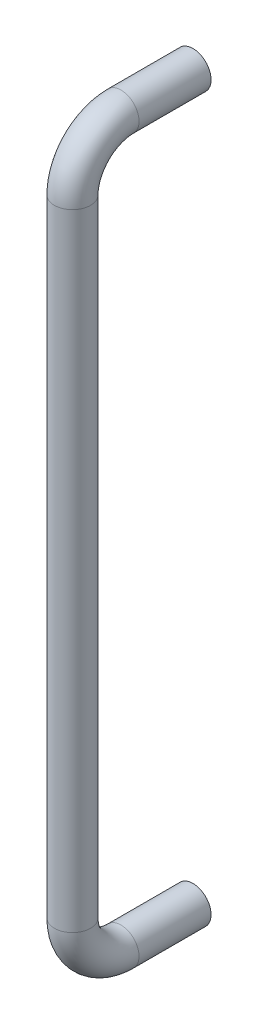
ISO-10303-21;
HEADER;
FILE_DESCRIPTION(('STEP AP214'),'2;1');
FILE_NAME('part.step','',(''),(''),'','','');
FILE_SCHEMA(('AUTOMOTIVE_DESIGN { 1 0 10303 214 1 1 1 1 }'));
ENDSEC;
DATA;
#1=APPLICATION_CONTEXT('core data for automotive mechanical design processes');
#2=APPLICATION_PROTOCOL_DEFINITION('international standard','automotive_design',2000,#1);
#3=PRODUCT_CONTEXT('',#1,'mechanical');
#4=PRODUCT('Part','Part','',(#3));
#5=PRODUCT_RELATED_PRODUCT_CATEGORY('part','',(#4));
#6=PRODUCT_DEFINITION_FORMATION('','',#4);
#7=PRODUCT_DEFINITION_CONTEXT('part definition',#1,'design');
#8=PRODUCT_DEFINITION('design','',#6,#7);
#9=PRODUCT_DEFINITION_SHAPE('','',#8);
#10=(LENGTH_UNIT() NAMED_UNIT(*) SI_UNIT(.MILLI.,.METRE.));
#11=(NAMED_UNIT(*) PLANE_ANGLE_UNIT() SI_UNIT($,.RADIAN.));
#12=(NAMED_UNIT(*) SI_UNIT($,.STERADIAN.) SOLID_ANGLE_UNIT());
#13=UNCERTAINTY_MEASURE_WITH_UNIT(LENGTH_MEASURE(1.E-05),#10,'distance_accuracy_value','');
#14=(GEOMETRIC_REPRESENTATION_CONTEXT(3) GLOBAL_UNCERTAINTY_ASSIGNED_CONTEXT((#13)) GLOBAL_UNIT_ASSIGNED_CONTEXT((#10,
#11,#12)) REPRESENTATION_CONTEXT('',''));
#15=CARTESIAN_POINT('',(0.,0.,0.));
#16=DIRECTION('',(0.,0.,1.));
#17=DIRECTION('',(1.,0.,0.));
#18=AXIS2_PLACEMENT_3D('',#15,#16,#17);
#19=CARTESIAN_POINT('',(0.,0.,0.));
#20=DIRECTION('',(0.,0.,1.));
#21=DIRECTION('',(1.,0.,0.));
#22=AXIS2_PLACEMENT_3D('',#19,#20,#21);
#23=PLANE('',#22);
#24=CARTESIAN_POINT('',(0.,0.,0.));
#25=DIRECTION('',(0.,0.,1.));
#26=DIRECTION('',(1.,0.,0.));
#27=AXIS2_PLACEMENT_3D('',#24,#25,#26);
#28=CIRCLE('',#27,0.15);
#29=CARTESIAN_POINT('',(0.15,0.,0.));
#30=VERTEX_POINT('',#29);
#31=EDGE_CURVE('E18',#30,#30,#28,.T.);
#32=ORIENTED_EDGE('',*,*,#31,.F.);
#33=EDGE_LOOP('',(#32));
#34=FACE_BOUND('',#33,.T.);
#35=ADVANCED_FACE('F15',(#34),#23,.F.);
#36=CARTESIAN_POINT('',(0.,6.,0.));
#37=DIRECTION('',(0.,0.,-1.));
#38=DIRECTION('',(0.,1.,0.));
#39=AXIS2_PLACEMENT_3D('',#36,#37,#38);
#40=PLANE('',#39);
#41=CARTESIAN_POINT('',(0.,6.,0.));
#42=DIRECTION('',(0.,0.,-1.));
#43=DIRECTION('',(0.,1.,0.));
#44=AXIS2_PLACEMENT_3D('',#41,#42,#43);
#45=CIRCLE('',#44,0.15);
#46=CARTESIAN_POINT('',(0.,6.15,0.));
#47=VERTEX_POINT('',#46);
#48=EDGE_CURVE('E50',#47,#47,#45,.F.);
#49=ORIENTED_EDGE('',*,*,#48,.F.);
#50=EDGE_LOOP('',(#49));
#51=FACE_BOUND('',#50,.T.);
#52=ADVANCED_FACE('F60',(#51),#40,.T.);
#53=CARTESIAN_POINT('',(0.,0.,0.597576790725));
#54=DIRECTION('',(0.,0.,1.));
#55=DIRECTION('',(1.,0.,0.));
#56=AXIS2_PLACEMENT_3D('',#53,#54,#55);
#57=CYLINDRICAL_SURFACE('',#56,0.15);
#58=CARTESIAN_POINT('',(0.,0.,0.597576790725));
#59=DIRECTION('',(0.,0.,-1.));
#60=DIRECTION('',(0.,-1.,0.));
#61=AXIS2_PLACEMENT_3D('',#58,#59,#60);
#62=CIRCLE('',#61,0.15);
#63=CARTESIAN_POINT('',(0.,-0.15,0.597576790725));
#64=VERTEX_POINT('',#63);
#65=EDGE_CURVE('E48',#64,#64,#62,.F.);
#66=ORIENTED_EDGE('',*,*,#65,.F.);
#67=EDGE_LOOP('',(#66));
#68=FACE_BOUND('',#67,.T.);
#69=ORIENTED_EDGE('',*,*,#31,.T.);
#70=EDGE_LOOP('',(#69));
#71=FACE_BOUND('',#70,.T.);
#72=ADVANCED_FACE('F57',(#68,#71),#57,.T.);
#73=CARTESIAN_POINT('',(0.,6.,0.));
#74=DIRECTION('',(0.,0.,-1.));
#75=DIRECTION('',(0.,1.,0.));
#76=AXIS2_PLACEMENT_3D('',#73,#74,#75);
#77=CYLINDRICAL_SURFACE('',#76,0.15);
#78=ORIENTED_EDGE('',*,*,#48,.T.);
#79=EDGE_LOOP('',(#78));
#80=FACE_BOUND('',#79,.T.);
#81=CARTESIAN_POINT('',(0.,6.,0.597576790725));
#82=DIRECTION('',(0.,0.,1.));
#83=DIRECTION('',(0.,1.,0.));
#84=AXIS2_PLACEMENT_3D('',#81,#82,#83);
#85=CIRCLE('',#84,0.15);
#86=CARTESIAN_POINT('',(0.,6.15,0.597576790725));
#87=VERTEX_POINT('',#86);
#88=EDGE_CURVE('E27',#87,#87,#85,.T.);
#89=ORIENTED_EDGE('',*,*,#88,.F.);
#90=EDGE_LOOP('',(#89));
#91=FACE_BOUND('',#90,.T.);
#92=ADVANCED_FACE('F43',(#80,#91),#77,.T.);
#93=CARTESIAN_POINT('',(0.,0.402423209275,0.597576790725));
#94=DIRECTION('',(1.,0.,0.));
#95=DIRECTION('',(0.,0.,-1.));
#96=AXIS2_PLACEMENT_3D('',#93,#94,#95);
#97=TOROIDAL_SURFACE('',#96,0.402423209275,0.15);
#98=CARTESIAN_POINT('',(0.,0.402423209275,1.));
#99=DIRECTION('',(0.,1.,0.));
#100=DIRECTION('',(0.,0.,1.));
#101=AXIS2_PLACEMENT_3D('',#98,#99,#100);
#102=CIRCLE('',#101,0.15);
#103=CARTESIAN_POINT('',(0.,0.402423209275,1.15));
#104=VERTEX_POINT('',#103);
#105=EDGE_CURVE('E22',#104,#104,#102,.T.);
#106=ORIENTED_EDGE('',*,*,#105,.F.);
#107=EDGE_LOOP('',(#106));
#108=FACE_BOUND('',#107,.T.);
#109=ORIENTED_EDGE('',*,*,#65,.T.);
#110=EDGE_LOOP('',(#109));
#111=FACE_BOUND('',#110,.T.);
#112=ADVANCED_FACE('F39',(#108,#111),#97,.T.);
#113=CARTESIAN_POINT('',(0.,5.597576790725,0.597576790725));
#114=DIRECTION('',(1.,0.,0.));
#115=DIRECTION('',(0.,0.,-1.));
#116=AXIS2_PLACEMENT_3D('',#113,#114,#115);
#117=TOROIDAL_SURFACE('',#116,0.402423209275,0.15);
#118=ORIENTED_EDGE('',*,*,#88,.T.);
#119=EDGE_LOOP('',(#118));
#120=FACE_BOUND('',#119,.T.);
#121=CARTESIAN_POINT('',(0.,5.597576790725,1.));
#122=DIRECTION('',(0.,1.,0.));
#123=DIRECTION('',(0.,0.,1.));
#124=AXIS2_PLACEMENT_3D('',#121,#122,#123);
#125=CIRCLE('',#124,0.15);
#126=CARTESIAN_POINT('',(0.,5.597576790725,1.15));
#127=VERTEX_POINT('',#126);
#128=EDGE_CURVE('E10',#127,#127,#125,.F.);
#129=ORIENTED_EDGE('',*,*,#128,.F.);
#130=EDGE_LOOP('',(#129));
#131=FACE_BOUND('',#130,.T.);
#132=ADVANCED_FACE('F34',(#120,#131),#117,.T.);
#133=CARTESIAN_POINT('',(0.,5.597576790725,1.));
#134=DIRECTION('',(0.,1.,0.));
#135=DIRECTION('',(0.,0.,1.));
#136=AXIS2_PLACEMENT_3D('',#133,#134,#135);
#137=CYLINDRICAL_SURFACE('',#136,0.15);
#138=ORIENTED_EDGE('',*,*,#128,.T.);
#139=EDGE_LOOP('',(#138));
#140=FACE_BOUND('',#139,.T.);
#141=ORIENTED_EDGE('',*,*,#105,.T.);
#142=EDGE_LOOP('',(#141));
#143=FACE_BOUND('',#142,.T.);
#144=ADVANCED_FACE('F38',(#140,#143),#137,.T.);
#145=CLOSED_SHELL('',(#35,#52,#72,#92,#112,#132,#144));
#146=MANIFOLD_SOLID_BREP('B1',#145);
#147=ADVANCED_BREP_SHAPE_REPRESENTATION('',(#18,#146),#14);
#148=SHAPE_DEFINITION_REPRESENTATION(#9,#147);
ENDSEC;
END-ISO-10303-21;
